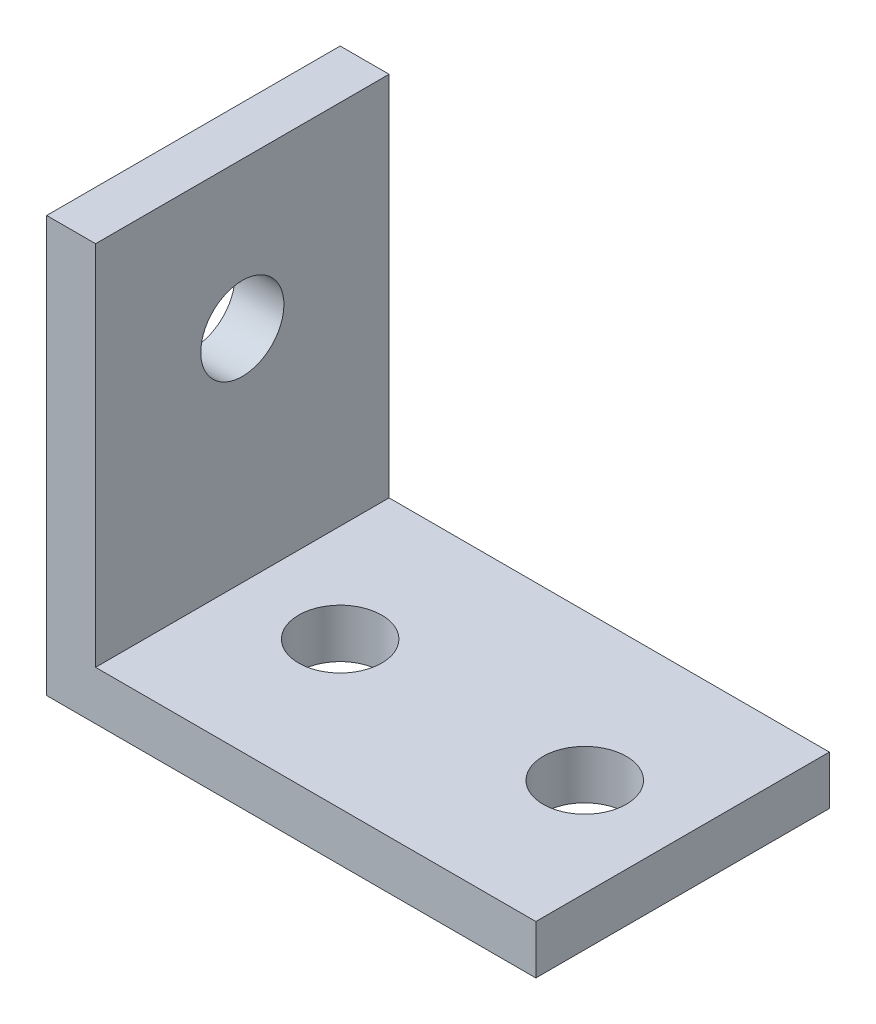
ISO-10303-21;
HEADER;
FILE_DESCRIPTION(('STEP AP214'),'2;1');
FILE_NAME('part.step','',(''),(''),'','','');
FILE_SCHEMA(('AUTOMOTIVE_DESIGN { 1 0 10303 214 1 1 1 1 }'));
ENDSEC;
DATA;
#1=APPLICATION_CONTEXT('core data for automotive mechanical design processes');
#2=APPLICATION_PROTOCOL_DEFINITION('international standard','automotive_design',2000,#1);
#3=PRODUCT_CONTEXT('',#1,'mechanical');
#4=PRODUCT('Part','Part','',(#3));
#5=PRODUCT_RELATED_PRODUCT_CATEGORY('part','',(#4));
#6=PRODUCT_DEFINITION_FORMATION('','',#4);
#7=PRODUCT_DEFINITION_CONTEXT('part definition',#1,'design');
#8=PRODUCT_DEFINITION('design','',#6,#7);
#9=PRODUCT_DEFINITION_SHAPE('','',#8);
#10=(LENGTH_UNIT() NAMED_UNIT(*) SI_UNIT(.MILLI.,.METRE.));
#11=(NAMED_UNIT(*) PLANE_ANGLE_UNIT() SI_UNIT($,.RADIAN.));
#12=(NAMED_UNIT(*) SI_UNIT($,.STERADIAN.) SOLID_ANGLE_UNIT());
#13=UNCERTAINTY_MEASURE_WITH_UNIT(LENGTH_MEASURE(1.E-05),#10,'distance_accuracy_value','');
#14=(GEOMETRIC_REPRESENTATION_CONTEXT(3) GLOBAL_UNCERTAINTY_ASSIGNED_CONTEXT((#13)) GLOBAL_UNIT_ASSIGNED_CONTEXT((#10,
#11,#12)) REPRESENTATION_CONTEXT('',''));
#15=CARTESIAN_POINT('',(0.,0.,0.));
#16=DIRECTION('',(0.,0.,1.));
#17=DIRECTION('',(1.,0.,0.));
#18=AXIS2_PLACEMENT_3D('',#15,#16,#17);
#19=CARTESIAN_POINT('',(0.,8.5,6.));
#20=DIRECTION('',(1.,0.,0.));
#21=DIRECTION('',(0.,1.,0.));
#22=AXIS2_PLACEMENT_3D('',#19,#20,#21);
#23=PLANE('',#22);
#24=CARTESIAN_POINT('',(0.,5.5,3.));
#25=DIRECTION('',(1.,0.,0.));
#26=DIRECTION('',(0.,1.,0.));
#27=AXIS2_PLACEMENT_3D('',#24,#25,#26);
#28=CIRCLE('',#27,0.85);
#29=CARTESIAN_POINT('',(0.,6.35,3.));
#30=VERTEX_POINT('',#29);
#31=EDGE_CURVE('E121',#30,#30,#28,.T.);
#32=ORIENTED_EDGE('',*,*,#31,.T.);
#33=EDGE_LOOP('',(#32));
#34=FACE_BOUND('',#33,.T.);
#35=DIRECTION('',(0.,-1.,0.));
#36=VECTOR('',#35,1.);
#37=CARTESIAN_POINT('',(0.,8.5,0.));
#38=LINE('',#37,#36);
#39=CARTESIAN_POINT('',(0.,8.5,0.));
#40=VERTEX_POINT('',#39);
#41=CARTESIAN_POINT('',(0.,0.,0.));
#42=VERTEX_POINT('',#41);
#43=EDGE_CURVE('E117',#40,#42,#38,.T.);
#44=ORIENTED_EDGE('',*,*,#43,.T.);
#45=DIRECTION('',(0.,0.,-1.));
#46=VECTOR('',#45,1.);
#47=CARTESIAN_POINT('',(0.,0.,6.));
#48=LINE('',#47,#46);
#49=CARTESIAN_POINT('',(0.,0.,6.));
#50=VERTEX_POINT('',#49);
#51=EDGE_CURVE('E11',#50,#42,#48,.T.);
#52=ORIENTED_EDGE('',*,*,#51,.F.);
#53=DIRECTION('',(0.,-1.,0.));
#54=VECTOR('',#53,1.);
#55=CARTESIAN_POINT('',(0.,8.5,6.));
#56=LINE('',#55,#54);
#57=CARTESIAN_POINT('',(0.,8.5,6.));
#58=VERTEX_POINT('',#57);
#59=EDGE_CURVE('E128',#58,#50,#56,.T.);
#60=ORIENTED_EDGE('',*,*,#59,.F.);
#61=DIRECTION('',(0.,0.,-1.));
#62=VECTOR('',#61,1.);
#63=CARTESIAN_POINT('',(0.,8.5,6.));
#64=LINE('',#63,#62);
#65=EDGE_CURVE('E113',#58,#40,#64,.T.);
#66=ORIENTED_EDGE('',*,*,#65,.T.);
#67=EDGE_LOOP('',(#44,#52,#60,#66));
#68=FACE_BOUND('',#67,.T.);
#69=ADVANCED_FACE('F33',(#34,#68),#23,.F.);
#70=CARTESIAN_POINT('',(0.,0.,6.));
#71=DIRECTION('',(0.,1.,0.));
#72=DIRECTION('',(0.,0.,1.));
#73=AXIS2_PLACEMENT_3D('',#70,#71,#72);
#74=PLANE('',#73);
#75=CARTESIAN_POINT('',(3.,0.,3.));
#76=DIRECTION('',(0.,1.,0.));
#77=DIRECTION('',(0.,0.,1.));
#78=AXIS2_PLACEMENT_3D('',#75,#76,#77);
#79=CIRCLE('',#78,0.85);
#80=CARTESIAN_POINT('',(3.,0.,3.85));
#81=VERTEX_POINT('',#80);
#82=EDGE_CURVE('E165',#81,#81,#79,.T.);
#83=ORIENTED_EDGE('',*,*,#82,.T.);
#84=EDGE_LOOP('',(#83));
#85=FACE_BOUND('',#84,.T.);
#86=CARTESIAN_POINT('',(8.,0.,3.));
#87=DIRECTION('',(0.,1.,0.));
#88=DIRECTION('',(0.,0.,1.));
#89=AXIS2_PLACEMENT_3D('',#86,#87,#88);
#90=CIRCLE('',#89,0.85);
#91=CARTESIAN_POINT('',(8.,0.,3.85));
#92=VERTEX_POINT('',#91);
#93=EDGE_CURVE('E172',#92,#92,#90,.T.);
#94=ORIENTED_EDGE('',*,*,#93,.T.);
#95=EDGE_LOOP('',(#94));
#96=FACE_BOUND('',#95,.T.);
#97=DIRECTION('',(1.,0.,0.));
#98=VECTOR('',#97,1.);
#99=CARTESIAN_POINT('',(0.,0.,0.));
#100=LINE('',#99,#98);
#101=CARTESIAN_POINT('',(10.,0.,0.));
#102=VERTEX_POINT('',#101);
#103=EDGE_CURVE('E120',#42,#102,#100,.T.);
#104=ORIENTED_EDGE('',*,*,#103,.T.);
#105=DIRECTION('',(0.,0.,-1.));
#106=VECTOR('',#105,1.);
#107=CARTESIAN_POINT('',(10.,0.,6.));
#108=LINE('',#107,#106);
#109=CARTESIAN_POINT('',(10.,0.,6.));
#110=VERTEX_POINT('',#109);
#111=EDGE_CURVE('E41',#110,#102,#108,.T.);
#112=ORIENTED_EDGE('',*,*,#111,.F.);
#113=DIRECTION('',(1.,0.,0.));
#114=VECTOR('',#113,1.);
#115=CARTESIAN_POINT('',(0.,0.,6.));
#116=LINE('',#115,#114);
#117=EDGE_CURVE('E86',#50,#110,#116,.T.);
#118=ORIENTED_EDGE('',*,*,#117,.F.);
#119=ORIENTED_EDGE('',*,*,#51,.T.);
#120=EDGE_LOOP('',(#104,#112,#118,#119));
#121=FACE_BOUND('',#120,.T.);
#122=ADVANCED_FACE('F153',(#85,#96,#121),#74,.F.);
#123=CARTESIAN_POINT('',(10.,0.,6.));
#124=DIRECTION('',(-1.,0.,0.));
#125=DIRECTION('',(0.,0.,1.));
#126=AXIS2_PLACEMENT_3D('',#123,#124,#125);
#127=PLANE('',#126);
#128=DIRECTION('',(0.,1.,0.));
#129=VECTOR('',#128,1.);
#130=CARTESIAN_POINT('',(10.,0.,0.));
#131=LINE('',#130,#129);
#132=CARTESIAN_POINT('',(10.,1.,0.));
#133=VERTEX_POINT('',#132);
#134=EDGE_CURVE('E123',#102,#133,#131,.T.);
#135=ORIENTED_EDGE('',*,*,#134,.T.);
#136=DIRECTION('',(0.,0.,-1.));
#137=VECTOR('',#136,1.);
#138=CARTESIAN_POINT('',(10.,1.,6.));
#139=LINE('',#138,#137);
#140=CARTESIAN_POINT('',(10.,1.,6.));
#141=VERTEX_POINT('',#140);
#142=EDGE_CURVE('E108',#141,#133,#139,.T.);
#143=ORIENTED_EDGE('',*,*,#142,.F.);
#144=DIRECTION('',(0.,1.,0.));
#145=VECTOR('',#144,1.);
#146=CARTESIAN_POINT('',(10.,0.,6.));
#147=LINE('',#146,#145);
#148=EDGE_CURVE('E99',#110,#141,#147,.T.);
#149=ORIENTED_EDGE('',*,*,#148,.F.);
#150=ORIENTED_EDGE('',*,*,#111,.T.);
#151=EDGE_LOOP('',(#135,#143,#149,#150));
#152=FACE_BOUND('',#151,.T.);
#153=ADVANCED_FACE('F134',(#152),#127,.F.);
#154=CARTESIAN_POINT('',(10.,1.,6.));
#155=DIRECTION('',(0.,-1.,0.));
#156=DIRECTION('',(1.,0.,0.));
#157=AXIS2_PLACEMENT_3D('',#154,#155,#156);
#158=PLANE('',#157);
#159=CARTESIAN_POINT('',(3.,0.999999999999999,3.));
#160=DIRECTION('',(0.,1.,0.));
#161=DIRECTION('',(-1.,0.,0.));
#162=AXIS2_PLACEMENT_3D('',#159,#160,#161);
#163=CIRCLE('',#162,0.85);
#164=CARTESIAN_POINT('',(2.15,0.999999999999999,3.));
#165=VERTEX_POINT('',#164);
#166=EDGE_CURVE('E175',#165,#165,#163,.T.);
#167=ORIENTED_EDGE('',*,*,#166,.F.);
#168=EDGE_LOOP('',(#167));
#169=FACE_BOUND('',#168,.T.);
#170=CARTESIAN_POINT('',(8.,1.,3.));
#171=DIRECTION('',(0.,1.,0.));
#172=DIRECTION('',(-1.,0.,0.));
#173=AXIS2_PLACEMENT_3D('',#170,#171,#172);
#174=CIRCLE('',#173,0.85);
#175=CARTESIAN_POINT('',(7.15,1.,3.));
#176=VERTEX_POINT('',#175);
#177=EDGE_CURVE('E176',#176,#176,#174,.T.);
#178=ORIENTED_EDGE('',*,*,#177,.F.);
#179=EDGE_LOOP('',(#178));
#180=FACE_BOUND('',#179,.T.);
#181=DIRECTION('',(-1.,0.,0.));
#182=VECTOR('',#181,1.);
#183=CARTESIAN_POINT('',(10.,1.,0.));
#184=LINE('',#183,#182);
#185=CARTESIAN_POINT('',(0.999999999999999,0.999999999999999,0.));
#186=VERTEX_POINT('',#185);
#187=EDGE_CURVE('E107',#133,#186,#184,.T.);
#188=ORIENTED_EDGE('',*,*,#187,.T.);
#189=DIRECTION('',(0.,0.,-1.));
#190=VECTOR('',#189,1.);
#191=CARTESIAN_POINT('',(0.999999999999999,0.999999999999999,6.));
#192=LINE('',#191,#190);
#193=CARTESIAN_POINT('',(0.999999999999999,0.999999999999999,6.));
#194=VERTEX_POINT('',#193);
#195=EDGE_CURVE('E104',#194,#186,#192,.T.);
#196=ORIENTED_EDGE('',*,*,#195,.F.);
#197=DIRECTION('',(-1.,0.,0.));
#198=VECTOR('',#197,1.);
#199=CARTESIAN_POINT('',(10.,1.,6.));
#200=LINE('',#199,#198);
#201=EDGE_CURVE('E93',#141,#194,#200,.T.);
#202=ORIENTED_EDGE('',*,*,#201,.F.);
#203=ORIENTED_EDGE('',*,*,#142,.T.);
#204=EDGE_LOOP('',(#188,#196,#202,#203));
#205=FACE_BOUND('',#204,.T.);
#206=ADVANCED_FACE('F105',(#169,#180,#205),#158,.F.);
#207=CARTESIAN_POINT('',(0.999999999999999,0.999999999999999,6.));
#208=DIRECTION('',(-1.,0.,0.));
#209=DIRECTION('',(0.,-1.,0.));
#210=AXIS2_PLACEMENT_3D('',#207,#208,#209);
#211=PLANE('',#210);
#212=CARTESIAN_POINT('',(1.,5.5,3.));
#213=DIRECTION('',(1.,0.,0.));
#214=DIRECTION('',(0.,1.,0.));
#215=AXIS2_PLACEMENT_3D('',#212,#213,#214);
#216=CIRCLE('',#215,0.85);
#217=CARTESIAN_POINT('',(1.,6.35,3.));
#218=VERTEX_POINT('',#217);
#219=EDGE_CURVE('E162',#218,#218,#216,.T.);
#220=ORIENTED_EDGE('',*,*,#219,.F.);
#221=EDGE_LOOP('',(#220));
#222=FACE_BOUND('',#221,.T.);
#223=DIRECTION('',(0.,1.,0.));
#224=VECTOR('',#223,1.);
#225=CARTESIAN_POINT('',(0.999999999999999,0.999999999999999,0.));
#226=LINE('',#225,#224);
#227=CARTESIAN_POINT('',(1.,8.5,0.));
#228=VERTEX_POINT('',#227);
#229=EDGE_CURVE('E72',#186,#228,#226,.T.);
#230=ORIENTED_EDGE('',*,*,#229,.T.);
#231=DIRECTION('',(0.,0.,-1.));
#232=VECTOR('',#231,1.);
#233=CARTESIAN_POINT('',(1.,8.5,6.));
#234=LINE('',#233,#232);
#235=CARTESIAN_POINT('',(1.,8.5,6.));
#236=VERTEX_POINT('',#235);
#237=EDGE_CURVE('E109',#236,#228,#234,.T.);
#238=ORIENTED_EDGE('',*,*,#237,.F.);
#239=DIRECTION('',(0.,1.,0.));
#240=VECTOR('',#239,1.);
#241=CARTESIAN_POINT('',(0.999999999999999,0.999999999999999,6.));
#242=LINE('',#241,#240);
#243=EDGE_CURVE('E97',#194,#236,#242,.T.);
#244=ORIENTED_EDGE('',*,*,#243,.F.);
#245=ORIENTED_EDGE('',*,*,#195,.T.);
#246=EDGE_LOOP('',(#230,#238,#244,#245));
#247=FACE_BOUND('',#246,.T.);
#248=ADVANCED_FACE('F111',(#222,#247),#211,.F.);
#249=CARTESIAN_POINT('',(1.,8.5,6.));
#250=DIRECTION('',(0.,-1.,0.));
#251=DIRECTION('',(0.,0.,-1.));
#252=AXIS2_PLACEMENT_3D('',#249,#250,#251);
#253=PLANE('',#252);
#254=DIRECTION('',(-1.,0.,0.));
#255=VECTOR('',#254,1.);
#256=CARTESIAN_POINT('',(1.,8.5,0.));
#257=LINE('',#256,#255);
#258=EDGE_CURVE('E78',#228,#40,#257,.T.);
#259=ORIENTED_EDGE('',*,*,#258,.T.);
#260=ORIENTED_EDGE('',*,*,#65,.F.);
#261=DIRECTION('',(-1.,0.,0.));
#262=VECTOR('',#261,1.);
#263=CARTESIAN_POINT('',(1.,8.5,6.));
#264=LINE('',#263,#262);
#265=EDGE_CURVE('E49',#236,#58,#264,.T.);
#266=ORIENTED_EDGE('',*,*,#265,.F.);
#267=ORIENTED_EDGE('',*,*,#237,.T.);
#268=EDGE_LOOP('',(#259,#260,#266,#267));
#269=FACE_BOUND('',#268,.T.);
#270=ADVANCED_FACE('F141',(#269),#253,.F.);
#271=CARTESIAN_POINT('',(0.,0.,6.));
#272=DIRECTION('',(0.,0.,1.));
#273=DIRECTION('',(1.,0.,0.));
#274=AXIS2_PLACEMENT_3D('',#271,#272,#273);
#275=PLANE('',#274);
#276=ORIENTED_EDGE('',*,*,#59,.T.);
#277=ORIENTED_EDGE('',*,*,#117,.T.);
#278=ORIENTED_EDGE('',*,*,#148,.T.);
#279=ORIENTED_EDGE('',*,*,#201,.T.);
#280=ORIENTED_EDGE('',*,*,#243,.T.);
#281=ORIENTED_EDGE('',*,*,#265,.T.);
#282=EDGE_LOOP('',(#276,#277,#278,#279,#280,#281));
#283=FACE_BOUND('',#282,.T.);
#284=ADVANCED_FACE('F95',(#283),#275,.T.);
#285=CARTESIAN_POINT('',(0.,0.,0.));
#286=DIRECTION('',(0.,0.,1.));
#287=DIRECTION('',(1.,0.,0.));
#288=AXIS2_PLACEMENT_3D('',#285,#286,#287);
#289=PLANE('',#288);
#290=ORIENTED_EDGE('',*,*,#43,.F.);
#291=ORIENTED_EDGE('',*,*,#258,.F.);
#292=ORIENTED_EDGE('',*,*,#229,.F.);
#293=ORIENTED_EDGE('',*,*,#187,.F.);
#294=ORIENTED_EDGE('',*,*,#134,.F.);
#295=ORIENTED_EDGE('',*,*,#103,.F.);
#296=EDGE_LOOP('',(#290,#291,#292,#293,#294,#295));
#297=FACE_BOUND('',#296,.T.);
#298=ADVANCED_FACE('F137',(#297),#289,.F.);
#299=CARTESIAN_POINT('',(-5.,5.5,3.));
#300=DIRECTION('',(1.,0.,0.));
#301=DIRECTION('',(0.,1.,0.));
#302=AXIS2_PLACEMENT_3D('',#299,#300,#301);
#303=CYLINDRICAL_SURFACE('',#302,0.85);
#304=ORIENTED_EDGE('',*,*,#219,.T.);
#305=EDGE_LOOP('',(#304));
#306=FACE_BOUND('',#305,.T.);
#307=ORIENTED_EDGE('',*,*,#31,.F.);
#308=EDGE_LOOP('',(#307));
#309=FACE_BOUND('',#308,.T.);
#310=ADVANCED_FACE('F193',(#306,#309),#303,.F.);
#311=CARTESIAN_POINT('',(8.,-5.,3.));
#312=DIRECTION('',(0.,1.,0.));
#313=DIRECTION('',(-1.,0.,0.));
#314=AXIS2_PLACEMENT_3D('',#311,#312,#313);
#315=CYLINDRICAL_SURFACE('',#314,0.85);
#316=ORIENTED_EDGE('',*,*,#177,.T.);
#317=EDGE_LOOP('',(#316));
#318=FACE_BOUND('',#317,.T.);
#319=ORIENTED_EDGE('',*,*,#93,.F.);
#320=EDGE_LOOP('',(#319));
#321=FACE_BOUND('',#320,.T.);
#322=ADVANCED_FACE('F190',(#318,#321),#315,.F.);
#323=CARTESIAN_POINT('',(3.,-5.,3.));
#324=DIRECTION('',(0.,1.,0.));
#325=DIRECTION('',(-1.,0.,0.));
#326=AXIS2_PLACEMENT_3D('',#323,#324,#325);
#327=CYLINDRICAL_SURFACE('',#326,0.85);
#328=ORIENTED_EDGE('',*,*,#166,.T.);
#329=EDGE_LOOP('',(#328));
#330=FACE_BOUND('',#329,.T.);
#331=ORIENTED_EDGE('',*,*,#82,.F.);
#332=EDGE_LOOP('',(#331));
#333=FACE_BOUND('',#332,.T.);
#334=ADVANCED_FACE('F182',(#330,#333),#327,.F.);
#335=CLOSED_SHELL('',(#69,#122,#153,#206,#248,#270,#284,#298,#310,#322,#334));
#336=MANIFOLD_SOLID_BREP('B2',#335);
#337=ADVANCED_BREP_SHAPE_REPRESENTATION('',(#18,#336),#14);
#338=SHAPE_DEFINITION_REPRESENTATION(#9,#337);
ENDSEC;
END-ISO-10303-21;
